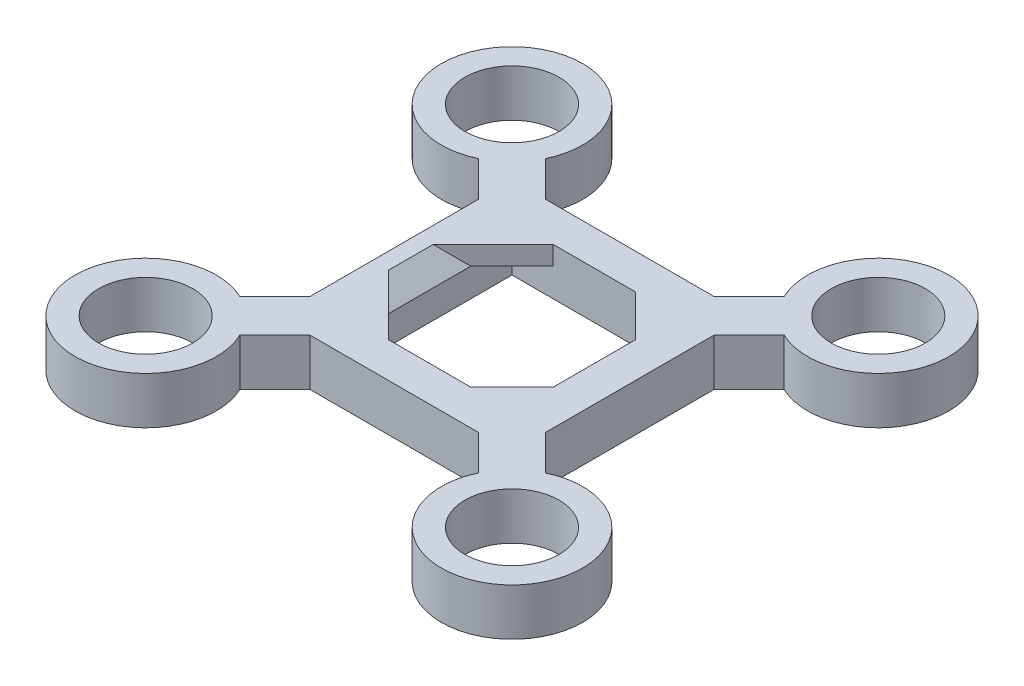
ISO-10303-21;
HEADER;
FILE_DESCRIPTION(('STEP AP214'),'2;1');
FILE_NAME('part.step','',(''),(''),'','','');
FILE_SCHEMA(('AUTOMOTIVE_DESIGN { 1 0 10303 214 1 1 1 1 }'));
ENDSEC;
DATA;
#1=APPLICATION_CONTEXT('core data for automotive mechanical design processes');
#2=APPLICATION_PROTOCOL_DEFINITION('international standard','automotive_design',2000,#1);
#3=PRODUCT_CONTEXT('',#1,'mechanical');
#4=PRODUCT('Part','Part','',(#3));
#5=PRODUCT_RELATED_PRODUCT_CATEGORY('part','',(#4));
#6=PRODUCT_DEFINITION_FORMATION('','',#4);
#7=PRODUCT_DEFINITION_CONTEXT('part definition',#1,'design');
#8=PRODUCT_DEFINITION('design','',#6,#7);
#9=PRODUCT_DEFINITION_SHAPE('','',#8);
#10=(LENGTH_UNIT() NAMED_UNIT(*) SI_UNIT(.MILLI.,.METRE.));
#11=(NAMED_UNIT(*) PLANE_ANGLE_UNIT() SI_UNIT($,.RADIAN.));
#12=(NAMED_UNIT(*) SI_UNIT($,.STERADIAN.) SOLID_ANGLE_UNIT());
#13=UNCERTAINTY_MEASURE_WITH_UNIT(LENGTH_MEASURE(1.E-05),#10,'distance_accuracy_value','');
#14=(GEOMETRIC_REPRESENTATION_CONTEXT(3) GLOBAL_UNCERTAINTY_ASSIGNED_CONTEXT((#13)) GLOBAL_UNIT_ASSIGNED_CONTEXT((#10,
#11,#12)) REPRESENTATION_CONTEXT('',''));
#15=CARTESIAN_POINT('',(0.,0.,0.));
#16=DIRECTION('',(0.,0.,1.));
#17=DIRECTION('',(1.,0.,0.));
#18=AXIS2_PLACEMENT_3D('',#15,#16,#17);
#19=CARTESIAN_POINT('',(1.75,1.,0.));
#20=DIRECTION('',(-1.,0.,0.));
#21=DIRECTION('',(0.,0.,1.));
#22=AXIS2_PLACEMENT_3D('',#19,#20,#21);
#23=PLANE('',#22);
#24=DIRECTION('',(0.,1.,0.));
#25=VECTOR('',#24,1.);
#26=CARTESIAN_POINT('',(1.75,0.6,0.875));
#27=LINE('',#26,#25);
#28=CARTESIAN_POINT('',(1.75,0.6,0.875));
#29=VERTEX_POINT('',#28);
#30=CARTESIAN_POINT('',(1.75,1.,0.875));
#31=VERTEX_POINT('',#30);
#32=EDGE_CURVE('E450',#29,#31,#27,.T.);
#33=ORIENTED_EDGE('',*,*,#32,.T.);
#34=DIRECTION('',(0.,0.,-1.));
#35=VECTOR('',#34,1.);
#36=CARTESIAN_POINT('',(1.75,1.,0.));
#37=LINE('',#36,#35);
#38=CARTESIAN_POINT('',(1.75,1.,-0.875000000000001));
#39=VERTEX_POINT('',#38);
#40=EDGE_CURVE('E385',#31,#39,#37,.T.);
#41=ORIENTED_EDGE('',*,*,#40,.T.);
#42=DIRECTION('',(0.,1.,0.));
#43=VECTOR('',#42,1.);
#44=CARTESIAN_POINT('',(1.75,0.6,-0.875000000000001));
#45=LINE('',#44,#43);
#46=CARTESIAN_POINT('',(1.75,0.6,-0.875000000000001));
#47=VERTEX_POINT('',#46);
#48=EDGE_CURVE('E352',#47,#39,#45,.T.);
#49=ORIENTED_EDGE('',*,*,#48,.F.);
#50=DIRECTION('',(0.,0.,-1.));
#51=VECTOR('',#50,1.);
#52=CARTESIAN_POINT('',(1.75,0.6,-0.875000000000001));
#53=LINE('',#52,#51);
#54=CARTESIAN_POINT('',(1.75,0.6,-1.75));
#55=VERTEX_POINT('',#54);
#56=EDGE_CURVE('E455',#47,#55,#53,.T.);
#57=ORIENTED_EDGE('',*,*,#56,.T.);
#58=DIRECTION('',(0.,-1.,0.));
#59=VECTOR('',#58,1.);
#60=CARTESIAN_POINT('',(1.75,1.,-1.75));
#61=LINE('',#60,#59);
#62=CARTESIAN_POINT('',(1.75,0.,-1.75));
#63=VERTEX_POINT('',#62);
#64=EDGE_CURVE('E272',#55,#63,#61,.T.);
#65=ORIENTED_EDGE('',*,*,#64,.T.);
#66=DIRECTION('',(0.,0.,-1.));
#67=VECTOR('',#66,1.);
#68=CARTESIAN_POINT('',(1.75,0.,0.));
#69=LINE('',#68,#67);
#70=CARTESIAN_POINT('',(1.75,0.,1.75));
#71=VERTEX_POINT('',#70);
#72=EDGE_CURVE('E260',#71,#63,#69,.T.);
#73=ORIENTED_EDGE('',*,*,#72,.F.);
#74=DIRECTION('',(0.,-1.,0.));
#75=VECTOR('',#74,1.);
#76=CARTESIAN_POINT('',(1.75,1.,1.75));
#77=LINE('',#76,#75);
#78=CARTESIAN_POINT('',(1.75,0.6,1.75));
#79=VERTEX_POINT('',#78);
#80=EDGE_CURVE('E279',#79,#71,#77,.T.);
#81=ORIENTED_EDGE('',*,*,#80,.F.);
#82=DIRECTION('',(0.,0.,-1.));
#83=VECTOR('',#82,1.);
#84=CARTESIAN_POINT('',(1.75,0.6,0.875));
#85=LINE('',#84,#83);
#86=EDGE_CURVE('E445',#79,#29,#85,.T.);
#87=ORIENTED_EDGE('',*,*,#86,.T.);
#88=EDGE_LOOP('',(#33,#41,#49,#57,#65,#73,#81,#87));
#89=FACE_BOUND('',#88,.T.);
#90=ADVANCED_FACE('F33',(#89),#23,.T.);
#91=CARTESIAN_POINT('',(0.,1.,1.75));
#92=DIRECTION('',(0.,0.,-1.));
#93=DIRECTION('',(-1.,0.,0.));
#94=AXIS2_PLACEMENT_3D('',#91,#92,#93);
#95=PLANE('',#94);
#96=DIRECTION('',(0.,1.,0.));
#97=VECTOR('',#96,1.);
#98=CARTESIAN_POINT('',(0.874999999999999,0.6,1.75));
#99=LINE('',#98,#97);
#100=CARTESIAN_POINT('',(0.874999999999999,0.6,1.75));
#101=VERTEX_POINT('',#100);
#102=CARTESIAN_POINT('',(0.874999999999999,1.,1.75));
#103=VERTEX_POINT('',#102);
#104=EDGE_CURVE('E447',#101,#103,#99,.T.);
#105=ORIENTED_EDGE('',*,*,#104,.F.);
#106=DIRECTION('',(1.,0.,0.));
#107=VECTOR('',#106,1.);
#108=CARTESIAN_POINT('',(1.75,0.6,1.75));
#109=LINE('',#108,#107);
#110=EDGE_CURVE('E443',#101,#79,#109,.T.);
#111=ORIENTED_EDGE('',*,*,#110,.T.);
#112=ORIENTED_EDGE('',*,*,#80,.T.);
#113=DIRECTION('',(1.,0.,0.));
#114=VECTOR('',#113,1.);
#115=CARTESIAN_POINT('',(0.,0.,1.75));
#116=LINE('',#115,#114);
#117=CARTESIAN_POINT('',(-1.75,0.,1.75));
#118=VERTEX_POINT('',#117);
#119=EDGE_CURVE('E263',#118,#71,#116,.T.);
#120=ORIENTED_EDGE('',*,*,#119,.F.);
#121=DIRECTION('',(0.,-1.,0.));
#122=VECTOR('',#121,1.);
#123=CARTESIAN_POINT('',(-1.75,1.,1.75));
#124=LINE('',#123,#122);
#125=CARTESIAN_POINT('',(-1.75,0.6,1.75));
#126=VERTEX_POINT('',#125);
#127=EDGE_CURVE('E277',#126,#118,#124,.T.);
#128=ORIENTED_EDGE('',*,*,#127,.F.);
#129=DIRECTION('',(1.,0.,0.));
#130=VECTOR('',#129,1.);
#131=CARTESIAN_POINT('',(-0.875,0.6,1.75));
#132=LINE('',#131,#130);
#133=CARTESIAN_POINT('',(-0.875,0.6,1.75));
#134=VERTEX_POINT('',#133);
#135=EDGE_CURVE('E345',#126,#134,#132,.T.);
#136=ORIENTED_EDGE('',*,*,#135,.T.);
#137=DIRECTION('',(0.,1.,0.));
#138=VECTOR('',#137,1.);
#139=CARTESIAN_POINT('',(-0.875,0.6,1.75));
#140=LINE('',#139,#138);
#141=CARTESIAN_POINT('',(-0.875,1.,1.75));
#142=VERTEX_POINT('',#141);
#143=EDGE_CURVE('E342',#134,#142,#140,.T.);
#144=ORIENTED_EDGE('',*,*,#143,.T.);
#145=DIRECTION('',(1.,0.,0.));
#146=VECTOR('',#145,1.);
#147=CARTESIAN_POINT('',(0.,1.,1.75));
#148=LINE('',#147,#146);
#149=EDGE_CURVE('E387',#142,#103,#148,.T.);
#150=ORIENTED_EDGE('',*,*,#149,.T.);
#151=EDGE_LOOP('',(#105,#111,#112,#120,#128,#136,#144,#150));
#152=FACE_BOUND('',#151,.T.);
#153=ADVANCED_FACE('F474',(#152),#95,.T.);
#154=CARTESIAN_POINT('',(-1.75,1.,0.));
#155=DIRECTION('',(-1.,0.,0.));
#156=DIRECTION('',(0.,0.,1.));
#157=AXIS2_PLACEMENT_3D('',#154,#155,#156);
#158=PLANE('',#157);
#159=DIRECTION('',(0.,0.,1.));
#160=VECTOR('',#159,1.);
#161=CARTESIAN_POINT('',(-1.75,0.6,-1.75));
#162=LINE('',#161,#160);
#163=CARTESIAN_POINT('',(-1.75,0.6,-1.75));
#164=VERTEX_POINT('',#163);
#165=CARTESIAN_POINT('',(-1.75,0.6,-0.875));
#166=VERTEX_POINT('',#165);
#167=EDGE_CURVE('E322',#164,#166,#162,.T.);
#168=ORIENTED_EDGE('',*,*,#167,.T.);
#169=DIRECTION('',(0.,0.,1.));
#170=VECTOR('',#169,1.);
#171=CARTESIAN_POINT('',(-1.75,0.599999999999999,0.875000000000001));
#172=LINE('',#171,#170);
#173=CARTESIAN_POINT('',(-1.75,0.6,0.875));
#174=VERTEX_POINT('',#173);
#175=EDGE_CURVE('E307',#166,#174,#172,.T.);
#176=ORIENTED_EDGE('',*,*,#175,.T.);
#177=DIRECTION('',(0.,0.,1.));
#178=VECTOR('',#177,1.);
#179=CARTESIAN_POINT('',(-1.75,0.6,1.75));
#180=LINE('',#179,#178);
#181=EDGE_CURVE('E348',#174,#126,#180,.T.);
#182=ORIENTED_EDGE('',*,*,#181,.T.);
#183=ORIENTED_EDGE('',*,*,#127,.T.);
#184=DIRECTION('',(0.,0.,-1.));
#185=VECTOR('',#184,1.);
#186=CARTESIAN_POINT('',(-1.75,0.,0.));
#187=LINE('',#186,#185);
#188=CARTESIAN_POINT('',(-1.75,0.,-1.75));
#189=VERTEX_POINT('',#188);
#190=EDGE_CURVE('E266',#118,#189,#187,.T.);
#191=ORIENTED_EDGE('',*,*,#190,.T.);
#192=DIRECTION('',(0.,-1.,0.));
#193=VECTOR('',#192,1.);
#194=CARTESIAN_POINT('',(-1.75,1.,-1.75));
#195=LINE('',#194,#193);
#196=EDGE_CURVE('E274',#164,#189,#195,.T.);
#197=ORIENTED_EDGE('',*,*,#196,.F.);
#198=EDGE_LOOP('',(#168,#176,#182,#183,#191,#197));
#199=FACE_BOUND('',#198,.T.);
#200=ADVANCED_FACE('F329',(#199),#158,.F.);
#201=CARTESIAN_POINT('',(0.353553390593218,1.,0.353553390593209));
#202=DIRECTION('',(-0.707106781186557,0.,-0.707106781186538));
#203=DIRECTION('',(-0.707106781186538,0.,0.707106781186557));
#204=AXIS2_PLACEMENT_3D('',#201,#202,#203);
#205=PLANE('',#204);
#206=DIRECTION('',(0.707106781186538,0.,-0.707106781186557));
#207=VECTOR('',#206,1.);
#208=CARTESIAN_POINT('',(0.353553390593218,1.,0.353553390593209));
#209=LINE('',#208,#207);
#210=CARTESIAN_POINT('',(-2.53553390593275,1.,3.24264068711925));
#211=VERTEX_POINT('',#210);
#212=CARTESIAN_POINT('',(-1.79289321881352,1.,2.5));
#213=VERTEX_POINT('',#212);
#214=EDGE_CURVE('E48',#211,#213,#209,.T.);
#215=ORIENTED_EDGE('',*,*,#214,.F.);
#216=DIRECTION('',(0.,1.,0.));
#217=VECTOR('',#216,1.);
#218=CARTESIAN_POINT('',(-2.53553390593275,0.,3.24264068711925));
#219=LINE('',#218,#217);
#220=CARTESIAN_POINT('',(-2.53553390593275,0.,3.24264068711925));
#221=VERTEX_POINT('',#220);
#222=EDGE_CURVE('E916',#211,#221,#219,.F.);
#223=ORIENTED_EDGE('',*,*,#222,.T.);
#224=DIRECTION('',(0.707106781186538,0.,-0.707106781186557));
#225=VECTOR('',#224,1.);
#226=CARTESIAN_POINT('',(0.353553390593218,0.,0.353553390593209));
#227=LINE('',#226,#225);
#228=CARTESIAN_POINT('',(-1.79289321881352,0.,2.5));
#229=VERTEX_POINT('',#228);
#230=EDGE_CURVE('E358',#221,#229,#227,.T.);
#231=ORIENTED_EDGE('',*,*,#230,.T.);
#232=DIRECTION('',(0.,-1.,0.));
#233=VECTOR('',#232,1.);
#234=CARTESIAN_POINT('',(-1.79289321881352,1.,2.5));
#235=LINE('',#234,#233);
#236=EDGE_CURVE('E275',#213,#229,#235,.T.);
#237=ORIENTED_EDGE('',*,*,#236,.F.);
#238=EDGE_LOOP('',(#215,#223,#231,#237));
#239=FACE_BOUND('',#238,.T.);
#240=ADVANCED_FACE('F531',(#239),#205,.F.);
#241=CARTESIAN_POINT('',(0.,1.,2.5));
#242=DIRECTION('',(0.,0.,-1.));
#243=DIRECTION('',(-1.,0.,0.));
#244=AXIS2_PLACEMENT_3D('',#241,#242,#243);
#245=PLANE('',#244);
#246=DIRECTION('',(1.,0.,0.));
#247=VECTOR('',#246,1.);
#248=CARTESIAN_POINT('',(0.,0.,2.5));
#249=LINE('',#248,#247);
#250=CARTESIAN_POINT('',(1.79289321881352,0.,2.5));
#251=VERTEX_POINT('',#250);
#252=EDGE_CURVE('E392',#229,#251,#249,.T.);
#253=ORIENTED_EDGE('',*,*,#252,.T.);
#254=DIRECTION('',(0.,-1.,0.));
#255=VECTOR('',#254,1.);
#256=CARTESIAN_POINT('',(1.79289321881352,1.,2.5));
#257=LINE('',#256,#255);
#258=CARTESIAN_POINT('',(1.79289321881352,1.,2.5));
#259=VERTEX_POINT('',#258);
#260=EDGE_CURVE('E300',#259,#251,#257,.T.);
#261=ORIENTED_EDGE('',*,*,#260,.F.);
#262=DIRECTION('',(1.,0.,0.));
#263=VECTOR('',#262,1.);
#264=CARTESIAN_POINT('',(0.,1.,2.5));
#265=LINE('',#264,#263);
#266=EDGE_CURVE('E360',#213,#259,#265,.T.);
#267=ORIENTED_EDGE('',*,*,#266,.F.);
#268=ORIENTED_EDGE('',*,*,#236,.T.);
#269=EDGE_LOOP('',(#253,#261,#267,#268));
#270=FACE_BOUND('',#269,.T.);
#271=ADVANCED_FACE('F528',(#270),#245,.F.);
#272=CARTESIAN_POINT('',(-0.353553390593219,1.,0.35355339059321));
#273=DIRECTION('',(-0.707106781186557,0.,0.707106781186538));
#274=DIRECTION('',(0.707106781186538,0.,0.707106781186557));
#275=AXIS2_PLACEMENT_3D('',#272,#273,#274);
#276=PLANE('',#275);
#277=DIRECTION('',(0.,1.,0.));
#278=VECTOR('',#277,1.);
#279=CARTESIAN_POINT('',(2.53553390593275,0.,3.24264068711926));
#280=LINE('',#279,#278);
#281=CARTESIAN_POINT('',(2.53553390593275,1.,3.24264068711926));
#282=VERTEX_POINT('',#281);
#283=CARTESIAN_POINT('',(2.53553390593275,0.,3.24264068711926));
#284=VERTEX_POINT('',#283);
#285=EDGE_CURVE('E421',#282,#284,#280,.F.);
#286=ORIENTED_EDGE('',*,*,#285,.F.);
#287=DIRECTION('',(-0.707106781186538,0.,-0.707106781186557));
#288=VECTOR('',#287,1.);
#289=CARTESIAN_POINT('',(-0.353553390593219,1.,0.35355339059321));
#290=LINE('',#289,#288);
#291=EDGE_CURVE('E363',#282,#259,#290,.T.);
#292=ORIENTED_EDGE('',*,*,#291,.T.);
#293=ORIENTED_EDGE('',*,*,#260,.T.);
#294=DIRECTION('',(-0.707106781186538,0.,-0.707106781186557));
#295=VECTOR('',#294,1.);
#296=CARTESIAN_POINT('',(-0.353553390593219,0.,0.35355339059321));
#297=LINE('',#296,#295);
#298=EDGE_CURVE('E395',#284,#251,#297,.T.);
#299=ORIENTED_EDGE('',*,*,#298,.F.);
#300=EDGE_LOOP('',(#286,#292,#293,#299));
#301=FACE_BOUND('',#300,.T.);
#302=ADVANCED_FACE('F525',(#301),#276,.T.);
#303=CARTESIAN_POINT('',(0.353553390593209,1.,-0.353553390593218));
#304=DIRECTION('',(-0.707106781186539,0.,0.707106781186556));
#305=DIRECTION('',(0.707106781186556,0.,0.707106781186539));
#306=AXIS2_PLACEMENT_3D('',#303,#304,#305);
#307=PLANE('',#306);
#308=DIRECTION('',(-0.707106781186556,0.,-0.707106781186539));
#309=VECTOR('',#308,1.);
#310=CARTESIAN_POINT('',(0.353553390593209,1.,-0.353553390593218));
#311=LINE('',#310,#309);
#312=CARTESIAN_POINT('',(3.24264068711925,1.,2.53553390593275));
#313=VERTEX_POINT('',#312);
#314=CARTESIAN_POINT('',(2.5,1.,1.79289321881352));
#315=VERTEX_POINT('',#314);
#316=EDGE_CURVE('E365',#313,#315,#311,.T.);
#317=ORIENTED_EDGE('',*,*,#316,.F.);
#318=DIRECTION('',(0.,1.,0.));
#319=VECTOR('',#318,1.);
#320=CARTESIAN_POINT('',(3.24264068711925,0.,2.53553390593275));
#321=LINE('',#320,#319);
#322=CARTESIAN_POINT('',(3.24264068711925,0.,2.53553390593275));
#323=VERTEX_POINT('',#322);
#324=EDGE_CURVE('E419',#313,#323,#321,.F.);
#325=ORIENTED_EDGE('',*,*,#324,.T.);
#326=DIRECTION('',(-0.707106781186556,0.,-0.707106781186539));
#327=VECTOR('',#326,1.);
#328=CARTESIAN_POINT('',(0.353553390593209,0.,-0.353553390593218));
#329=LINE('',#328,#327);
#330=CARTESIAN_POINT('',(2.5,0.,1.79289321881352));
#331=VERTEX_POINT('',#330);
#332=EDGE_CURVE('E397',#323,#331,#329,.T.);
#333=ORIENTED_EDGE('',*,*,#332,.T.);
#334=DIRECTION('',(0.,-1.,0.));
#335=VECTOR('',#334,1.);
#336=CARTESIAN_POINT('',(2.5,1.,1.79289321881352));
#337=LINE('',#336,#335);
#338=EDGE_CURVE('E297',#315,#331,#337,.T.);
#339=ORIENTED_EDGE('',*,*,#338,.F.);
#340=EDGE_LOOP('',(#317,#325,#333,#339));
#341=FACE_BOUND('',#340,.T.);
#342=ADVANCED_FACE('F418',(#341),#307,.F.);
#343=CARTESIAN_POINT('',(2.5,1.,0.));
#344=DIRECTION('',(-1.,0.,0.));
#345=DIRECTION('',(0.,0.,1.));
#346=AXIS2_PLACEMENT_3D('',#343,#344,#345);
#347=PLANE('',#346);
#348=DIRECTION('',(0.,0.,-1.));
#349=VECTOR('',#348,1.);
#350=CARTESIAN_POINT('',(2.5,0.,0.));
#351=LINE('',#350,#349);
#352=CARTESIAN_POINT('',(2.5,0.,-1.79289321881352));
#353=VERTEX_POINT('',#352);
#354=EDGE_CURVE('E248',#331,#353,#351,.T.);
#355=ORIENTED_EDGE('',*,*,#354,.T.);
#356=DIRECTION('',(0.,-1.,0.));
#357=VECTOR('',#356,1.);
#358=CARTESIAN_POINT('',(2.5,1.,-1.79289321881352));
#359=LINE('',#358,#357);
#360=CARTESIAN_POINT('',(2.5,1.,-1.79289321881352));
#361=VERTEX_POINT('',#360);
#362=EDGE_CURVE('E294',#361,#353,#359,.T.);
#363=ORIENTED_EDGE('',*,*,#362,.F.);
#364=DIRECTION('',(0.,0.,-1.));
#365=VECTOR('',#364,1.);
#366=CARTESIAN_POINT('',(2.5,1.,0.));
#367=LINE('',#366,#365);
#368=EDGE_CURVE('E367',#315,#361,#367,.T.);
#369=ORIENTED_EDGE('',*,*,#368,.F.);
#370=ORIENTED_EDGE('',*,*,#338,.T.);
#371=EDGE_LOOP('',(#355,#363,#369,#370));
#372=FACE_BOUND('',#371,.T.);
#373=ADVANCED_FACE('F402',(#372),#347,.F.);
#374=CARTESIAN_POINT('',(0.353553390593209,1.,0.353553390593218));
#375=DIRECTION('',(0.707106781186539,0.,0.707106781186556));
#376=DIRECTION('',(0.707106781186556,0.,-0.707106781186539));
#377=AXIS2_PLACEMENT_3D('',#374,#375,#376);
#378=PLANE('',#377);
#379=DIRECTION('',(0.,1.,0.));
#380=VECTOR('',#379,1.);
#381=CARTESIAN_POINT('',(3.24264068711925,0.,-2.53553390593275));
#382=LINE('',#381,#380);
#383=CARTESIAN_POINT('',(3.24264068711925,1.,-2.53553390593275));
#384=VERTEX_POINT('',#383);
#385=CARTESIAN_POINT('',(3.24264068711925,0.,-2.53553390593275));
#386=VERTEX_POINT('',#385);
#387=EDGE_CURVE('E225',#384,#386,#382,.F.);
#388=ORIENTED_EDGE('',*,*,#387,.F.);
#389=DIRECTION('',(-0.707106781186556,0.,0.707106781186539));
#390=VECTOR('',#389,1.);
#391=CARTESIAN_POINT('',(0.353553390593209,1.,0.353553390593218));
#392=LINE('',#391,#390);
#393=EDGE_CURVE('E370',#384,#361,#392,.T.);
#394=ORIENTED_EDGE('',*,*,#393,.T.);
#395=ORIENTED_EDGE('',*,*,#362,.T.);
#396=DIRECTION('',(-0.707106781186556,0.,0.707106781186539));
#397=VECTOR('',#396,1.);
#398=CARTESIAN_POINT('',(0.353553390593209,0.,0.353553390593218));
#399=LINE('',#398,#397);
#400=EDGE_CURVE('E244',#386,#353,#399,.T.);
#401=ORIENTED_EDGE('',*,*,#400,.F.);
#402=EDGE_LOOP('',(#388,#394,#395,#401));
#403=FACE_BOUND('',#402,.T.);
#404=ADVANCED_FACE('F407',(#403),#378,.T.);
#405=CARTESIAN_POINT('',(-0.353553390593219,1.,-0.35355339059321));
#406=DIRECTION('',(0.707106781186557,0.,0.707106781186538));
#407=DIRECTION('',(0.707106781186538,0.,-0.707106781186557));
#408=AXIS2_PLACEMENT_3D('',#405,#406,#407);
#409=PLANE('',#408);
#410=DIRECTION('',(-0.707106781186538,0.,0.707106781186557));
#411=VECTOR('',#410,1.);
#412=CARTESIAN_POINT('',(-0.353553390593219,1.,-0.35355339059321));
#413=LINE('',#412,#411);
#414=CARTESIAN_POINT('',(2.53553390593275,1.,-3.24264068711926));
#415=VERTEX_POINT('',#414);
#416=CARTESIAN_POINT('',(1.79289321881352,1.,-2.5));
#417=VERTEX_POINT('',#416);
#418=EDGE_CURVE('E236',#415,#417,#413,.T.);
#419=ORIENTED_EDGE('',*,*,#418,.F.);
#420=DIRECTION('',(0.,1.,0.));
#421=VECTOR('',#420,1.);
#422=CARTESIAN_POINT('',(2.53553390593275,0.,-3.24264068711926));
#423=LINE('',#422,#421);
#424=CARTESIAN_POINT('',(2.53553390593275,0.,-3.24264068711926));
#425=VERTEX_POINT('',#424);
#426=EDGE_CURVE('E222',#415,#425,#423,.F.);
#427=ORIENTED_EDGE('',*,*,#426,.T.);
#428=DIRECTION('',(-0.707106781186538,0.,0.707106781186557));
#429=VECTOR('',#428,1.);
#430=CARTESIAN_POINT('',(-0.353553390593219,0.,-0.35355339059321));
#431=LINE('',#430,#429);
#432=CARTESIAN_POINT('',(1.79289321881352,0.,-2.5));
#433=VERTEX_POINT('',#432);
#434=EDGE_CURVE('E234',#425,#433,#431,.T.);
#435=ORIENTED_EDGE('',*,*,#434,.T.);
#436=DIRECTION('',(0.,-1.,0.));
#437=VECTOR('',#436,1.);
#438=CARTESIAN_POINT('',(1.79289321881352,1.,-2.5));
#439=LINE('',#438,#437);
#440=EDGE_CURVE('E292',#417,#433,#439,.T.);
#441=ORIENTED_EDGE('',*,*,#440,.F.);
#442=EDGE_LOOP('',(#419,#427,#435,#441));
#443=FACE_BOUND('',#442,.T.);
#444=ADVANCED_FACE('F232',(#443),#409,.F.);
#445=CARTESIAN_POINT('',(0.,1.,-2.5));
#446=DIRECTION('',(0.,0.,-1.));
#447=DIRECTION('',(-1.,0.,0.));
#448=AXIS2_PLACEMENT_3D('',#445,#446,#447);
#449=PLANE('',#448);
#450=DIRECTION('',(1.,0.,0.));
#451=VECTOR('',#450,1.);
#452=CARTESIAN_POINT('',(0.,0.,-2.5));
#453=LINE('',#452,#451);
#454=CARTESIAN_POINT('',(-1.79289321881352,0.,-2.5));
#455=VERTEX_POINT('',#454);
#456=EDGE_CURVE('E243',#455,#433,#453,.T.);
#457=ORIENTED_EDGE('',*,*,#456,.F.);
#458=DIRECTION('',(0.,-1.,0.));
#459=VECTOR('',#458,1.);
#460=CARTESIAN_POINT('',(-1.79289321881352,1.,-2.5));
#461=LINE('',#460,#459);
#462=CARTESIAN_POINT('',(-1.79289321881352,1.,-2.5));
#463=VERTEX_POINT('',#462);
#464=EDGE_CURVE('E289',#463,#455,#461,.T.);
#465=ORIENTED_EDGE('',*,*,#464,.F.);
#466=DIRECTION('',(1.,0.,0.));
#467=VECTOR('',#466,1.);
#468=CARTESIAN_POINT('',(0.,1.,-2.5));
#469=LINE('',#468,#467);
#470=EDGE_CURVE('E373',#463,#417,#469,.T.);
#471=ORIENTED_EDGE('',*,*,#470,.T.);
#472=ORIENTED_EDGE('',*,*,#440,.T.);
#473=EDGE_LOOP('',(#457,#465,#471,#472));
#474=FACE_BOUND('',#473,.T.);
#475=ADVANCED_FACE('F512',(#474),#449,.T.);
#476=CARTESIAN_POINT('',(0.353553390593218,1.,-0.353553390593209));
#477=DIRECTION('',(0.707106781186557,0.,-0.707106781186538));
#478=DIRECTION('',(-0.707106781186538,0.,-0.707106781186557));
#479=AXIS2_PLACEMENT_3D('',#476,#477,#478);
#480=PLANE('',#479);
#481=DIRECTION('',(0.,1.,0.));
#482=VECTOR('',#481,1.);
#483=CARTESIAN_POINT('',(-2.53553390593275,0.,-3.24264068711925));
#484=LINE('',#483,#482);
#485=CARTESIAN_POINT('',(-2.53553390593275,1.,-3.24264068711925));
#486=VERTEX_POINT('',#485);
#487=CARTESIAN_POINT('',(-2.53553390593275,0.,-3.24264068711925));
#488=VERTEX_POINT('',#487);
#489=EDGE_CURVE('E436',#486,#488,#484,.F.);
#490=ORIENTED_EDGE('',*,*,#489,.F.);
#491=DIRECTION('',(0.707106781186538,0.,0.707106781186557));
#492=VECTOR('',#491,1.);
#493=CARTESIAN_POINT('',(0.353553390593218,1.,-0.353553390593209));
#494=LINE('',#493,#492);
#495=EDGE_CURVE('E376',#486,#463,#494,.T.);
#496=ORIENTED_EDGE('',*,*,#495,.T.);
#497=ORIENTED_EDGE('',*,*,#464,.T.);
#498=DIRECTION('',(0.707106781186538,0.,0.707106781186557));
#499=VECTOR('',#498,1.);
#500=CARTESIAN_POINT('',(0.353553390593218,0.,-0.353553390593209));
#501=LINE('',#500,#499);
#502=EDGE_CURVE('E246',#488,#455,#501,.T.);
#503=ORIENTED_EDGE('',*,*,#502,.F.);
#504=EDGE_LOOP('',(#490,#496,#497,#503));
#505=FACE_BOUND('',#504,.T.);
#506=ADVANCED_FACE('F508',(#505),#480,.T.);
#507=CARTESIAN_POINT('',(-0.353553390593211,1.,0.35355339059322));
#508=DIRECTION('',(0.707106781186539,0.,-0.707106781186557));
#509=DIRECTION('',(-0.707106781186557,0.,-0.707106781186539));
#510=AXIS2_PLACEMENT_3D('',#507,#508,#509);
#511=PLANE('',#510);
#512=DIRECTION('',(0.707106781186557,0.,0.707106781186539));
#513=VECTOR('',#512,1.);
#514=CARTESIAN_POINT('',(-0.353553390593211,1.,0.35355339059322));
#515=LINE('',#514,#513);
#516=CARTESIAN_POINT('',(-3.24264068711926,1.,-2.53553390593275));
#517=VERTEX_POINT('',#516);
#518=CARTESIAN_POINT('',(-2.5,1.,-1.79289321881352));
#519=VERTEX_POINT('',#518);
#520=EDGE_CURVE('E378',#517,#519,#515,.T.);
#521=ORIENTED_EDGE('',*,*,#520,.F.);
#522=DIRECTION('',(0.,1.,0.));
#523=VECTOR('',#522,1.);
#524=CARTESIAN_POINT('',(-3.24264068711926,0.,-2.53553390593275));
#525=LINE('',#524,#523);
#526=CARTESIAN_POINT('',(-3.24264068711926,0.,-2.53553390593275));
#527=VERTEX_POINT('',#526);
#528=EDGE_CURVE('E432',#517,#527,#525,.F.);
#529=ORIENTED_EDGE('',*,*,#528,.T.);
#530=DIRECTION('',(0.707106781186557,0.,0.707106781186539));
#531=VECTOR('',#530,1.);
#532=CARTESIAN_POINT('',(-0.353553390593211,0.,0.35355339059322));
#533=LINE('',#532,#531);
#534=CARTESIAN_POINT('',(-2.5,0.,-1.79289321881352));
#535=VERTEX_POINT('',#534);
#536=EDGE_CURVE('E253',#527,#535,#533,.T.);
#537=ORIENTED_EDGE('',*,*,#536,.T.);
#538=DIRECTION('',(0.,-1.,0.));
#539=VECTOR('',#538,1.);
#540=CARTESIAN_POINT('',(-2.5,1.,-1.79289321881352));
#541=LINE('',#540,#539);
#542=EDGE_CURVE('E285',#519,#535,#541,.T.);
#543=ORIENTED_EDGE('',*,*,#542,.F.);
#544=EDGE_LOOP('',(#521,#529,#537,#543));
#545=FACE_BOUND('',#544,.T.);
#546=ADVANCED_FACE('F504',(#545),#511,.F.);
#547=CARTESIAN_POINT('',(-2.5,1.,0.));
#548=DIRECTION('',(-1.,0.,0.));
#549=DIRECTION('',(0.,0.,1.));
#550=AXIS2_PLACEMENT_3D('',#547,#548,#549);
#551=PLANE('',#550);
#552=DIRECTION('',(0.,0.,-1.));
#553=VECTOR('',#552,1.);
#554=CARTESIAN_POINT('',(-2.5,0.,0.));
#555=LINE('',#554,#553);
#556=CARTESIAN_POINT('',(-2.5,0.,1.79289321881352));
#557=VERTEX_POINT('',#556);
#558=EDGE_CURVE('E255',#557,#535,#555,.T.);
#559=ORIENTED_EDGE('',*,*,#558,.F.);
#560=DIRECTION('',(0.,-1.,0.));
#561=VECTOR('',#560,1.);
#562=CARTESIAN_POINT('',(-2.5,1.,1.79289321881352));
#563=LINE('',#562,#561);
#564=CARTESIAN_POINT('',(-2.5,1.,1.79289321881352));
#565=VERTEX_POINT('',#564);
#566=EDGE_CURVE('E282',#565,#557,#563,.T.);
#567=ORIENTED_EDGE('',*,*,#566,.F.);
#568=DIRECTION('',(0.,0.,-1.));
#569=VECTOR('',#568,1.);
#570=CARTESIAN_POINT('',(-2.5,1.,0.));
#571=LINE('',#570,#569);
#572=EDGE_CURVE('E380',#565,#519,#571,.T.);
#573=ORIENTED_EDGE('',*,*,#572,.T.);
#574=ORIENTED_EDGE('',*,*,#542,.T.);
#575=EDGE_LOOP('',(#559,#567,#573,#574));
#576=FACE_BOUND('',#575,.T.);
#577=ADVANCED_FACE('F500',(#576),#551,.T.);
#578=CARTESIAN_POINT('',(-0.353553390593211,1.,-0.35355339059322));
#579=DIRECTION('',(-0.707106781186539,0.,-0.707106781186557));
#580=DIRECTION('',(-0.707106781186557,0.,0.707106781186539));
#581=AXIS2_PLACEMENT_3D('',#578,#579,#580);
#582=PLANE('',#581);
#583=DIRECTION('',(0.,1.,0.));
#584=VECTOR('',#583,1.);
#585=CARTESIAN_POINT('',(-3.24264068711926,0.,2.53553390593275));
#586=LINE('',#585,#584);
#587=CARTESIAN_POINT('',(-3.24264068711926,1.,2.53553390593275));
#588=VERTEX_POINT('',#587);
#589=CARTESIAN_POINT('',(-3.24264068711926,0.,2.53553390593275));
#590=VERTEX_POINT('',#589);
#591=EDGE_CURVE('E913',#588,#590,#586,.F.);
#592=ORIENTED_EDGE('',*,*,#591,.F.);
#593=DIRECTION('',(0.707106781186556,0.,-0.707106781186539));
#594=VECTOR('',#593,1.);
#595=CARTESIAN_POINT('',(-0.353553390593211,1.,-0.35355339059322));
#596=LINE('',#595,#594);
#597=EDGE_CURVE('E383',#588,#565,#596,.T.);
#598=ORIENTED_EDGE('',*,*,#597,.T.);
#599=ORIENTED_EDGE('',*,*,#566,.T.);
#600=DIRECTION('',(0.707106781186556,0.,-0.707106781186539));
#601=VECTOR('',#600,1.);
#602=CARTESIAN_POINT('',(-0.353553390593211,0.,-0.35355339059322));
#603=LINE('',#602,#601);
#604=EDGE_CURVE('E258',#590,#557,#603,.T.);
#605=ORIENTED_EDGE('',*,*,#604,.F.);
#606=EDGE_LOOP('',(#592,#598,#599,#605));
#607=FACE_BOUND('',#606,.T.);
#608=ADVANCED_FACE('F496',(#607),#582,.T.);
#609=CARTESIAN_POINT('',(0.,1.,-1.75));
#610=DIRECTION('',(0.,0.,-1.));
#611=DIRECTION('',(-1.,0.,0.));
#612=AXIS2_PLACEMENT_3D('',#609,#610,#611);
#613=PLANE('',#612);
#614=DIRECTION('',(-1.,0.,0.));
#615=VECTOR('',#614,1.);
#616=CARTESIAN_POINT('',(1.75,0.6,-1.75));
#617=LINE('',#616,#615);
#618=CARTESIAN_POINT('',(0.874999999999999,0.6,-1.75));
#619=VERTEX_POINT('',#618);
#620=EDGE_CURVE('E458',#55,#619,#617,.T.);
#621=ORIENTED_EDGE('',*,*,#620,.T.);
#622=DIRECTION('',(0.,1.,0.));
#623=VECTOR('',#622,1.);
#624=CARTESIAN_POINT('',(0.874999999999999,0.6,-1.75));
#625=LINE('',#624,#623);
#626=CARTESIAN_POINT('',(0.874999999999999,1.,-1.75));
#627=VERTEX_POINT('',#626);
#628=EDGE_CURVE('E464',#619,#627,#625,.T.);
#629=ORIENTED_EDGE('',*,*,#628,.T.);
#630=DIRECTION('',(1.,0.,0.));
#631=VECTOR('',#630,1.);
#632=CARTESIAN_POINT('',(0.,1.,-1.75));
#633=LINE('',#632,#631);
#634=CARTESIAN_POINT('',(-0.875,1.,-1.75));
#635=VERTEX_POINT('',#634);
#636=EDGE_CURVE('E286',#635,#627,#633,.T.);
#637=ORIENTED_EDGE('',*,*,#636,.F.);
#638=DIRECTION('',(0.,1.,0.));
#639=VECTOR('',#638,1.);
#640=CARTESIAN_POINT('',(-0.875,0.6,-1.75));
#641=LINE('',#640,#639);
#642=CARTESIAN_POINT('',(-0.875,0.6,-1.75));
#643=VERTEX_POINT('',#642);
#644=EDGE_CURVE('E355',#643,#635,#641,.T.);
#645=ORIENTED_EDGE('',*,*,#644,.F.);
#646=DIRECTION('',(-1.,0.,0.));
#647=VECTOR('',#646,1.);
#648=CARTESIAN_POINT('',(-0.875,0.6,-1.75));
#649=LINE('',#648,#647);
#650=EDGE_CURVE('E324',#643,#164,#649,.T.);
#651=ORIENTED_EDGE('',*,*,#650,.T.);
#652=ORIENTED_EDGE('',*,*,#196,.T.);
#653=DIRECTION('',(1.,0.,0.));
#654=VECTOR('',#653,1.);
#655=CARTESIAN_POINT('',(0.,0.,-1.75));
#656=LINE('',#655,#654);
#657=EDGE_CURVE('E269',#189,#63,#656,.T.);
#658=ORIENTED_EDGE('',*,*,#657,.T.);
#659=ORIENTED_EDGE('',*,*,#64,.F.);
#660=EDGE_LOOP('',(#621,#629,#637,#645,#651,#652,#658,#659));
#661=FACE_BOUND('',#660,.T.);
#662=ADVANCED_FACE('F499',(#661),#613,.F.);
#663=CARTESIAN_POINT('',(0.,1.,0.));
#664=DIRECTION('',(0.,1.,0.));
#665=DIRECTION('',(0.,0.,1.));
#666=AXIS2_PLACEMENT_3D('',#663,#664,#665);
#667=PLANE('',#666);
#668=CARTESIAN_POINT('',(-3.88908729652601,1.,3.88908729652601));
#669=DIRECTION('',(0.,1.,0.));
#670=DIRECTION('',(0.,0.,-1.));
#671=AXIS2_PLACEMENT_3D('',#668,#669,#670);
#672=CIRCLE('',#671,1.);
#673=CARTESIAN_POINT('',(-3.88908729652601,1.,2.88908729652601));
#674=VERTEX_POINT('',#673);
#675=EDGE_CURVE('E897',#674,#674,#672,.T.);
#676=ORIENTED_EDGE('',*,*,#675,.F.);
#677=EDGE_LOOP('',(#676));
#678=FACE_BOUND('',#677,.T.);
#679=CARTESIAN_POINT('',(3.88908729652601,1.,-3.88908729652601));
#680=DIRECTION('',(0.,1.,0.));
#681=DIRECTION('',(0.,0.,1.));
#682=AXIS2_PLACEMENT_3D('',#679,#680,#681);
#683=CIRCLE('',#682,0.999999999999993);
#684=CARTESIAN_POINT('',(3.88908729652601,1.,-2.88908729652602));
#685=VERTEX_POINT('',#684);
#686=EDGE_CURVE('E899',#685,#685,#683,.T.);
#687=ORIENTED_EDGE('',*,*,#686,.F.);
#688=EDGE_LOOP('',(#687));
#689=FACE_BOUND('',#688,.T.);
#690=CARTESIAN_POINT('',(3.88908729652601,1.,3.88908729652601));
#691=DIRECTION('',(0.,1.,0.));
#692=DIRECTION('',(0.,0.,-1.));
#693=AXIS2_PLACEMENT_3D('',#690,#691,#692);
#694=CIRCLE('',#693,1.);
#695=CARTESIAN_POINT('',(3.88908729652601,1.,2.88908729652601));
#696=VERTEX_POINT('',#695);
#697=EDGE_CURVE('E941',#696,#696,#694,.T.);
#698=ORIENTED_EDGE('',*,*,#697,.F.);
#699=EDGE_LOOP('',(#698));
#700=FACE_BOUND('',#699,.T.);
#701=CARTESIAN_POINT('',(-3.88908729652601,1.,-3.88908729652601));
#702=DIRECTION('',(0.,1.,0.));
#703=DIRECTION('',(0.,0.,1.));
#704=AXIS2_PLACEMENT_3D('',#701,#702,#703);
#705=CIRCLE('',#704,1.);
#706=CARTESIAN_POINT('',(-3.88908729652601,1.,-2.88908729652601));
#707=VERTEX_POINT('',#706);
#708=EDGE_CURVE('E906',#707,#707,#705,.T.);
#709=ORIENTED_EDGE('',*,*,#708,.F.);
#710=EDGE_LOOP('',(#709));
#711=FACE_BOUND('',#710,.T.);
#712=CARTESIAN_POINT('',(-3.88908729652601,1.,3.88908729652601));
#713=DIRECTION('',(0.,1.,0.));
#714=DIRECTION('',(0.,0.,-1.));
#715=AXIS2_PLACEMENT_3D('',#712,#713,#714);
#716=CIRCLE('',#715,1.5);
#717=EDGE_CURVE('E55',#588,#211,#716,.T.);
#718=ORIENTED_EDGE('',*,*,#717,.T.);
#719=ORIENTED_EDGE('',*,*,#214,.T.);
#720=ORIENTED_EDGE('',*,*,#266,.T.);
#721=ORIENTED_EDGE('',*,*,#291,.F.);
#722=CARTESIAN_POINT('',(3.88908729652601,1.,3.88908729652601));
#723=DIRECTION('',(0.,1.,0.));
#724=DIRECTION('',(0.,0.,-1.));
#725=AXIS2_PLACEMENT_3D('',#722,#723,#724);
#726=CIRCLE('',#725,1.5);
#727=EDGE_CURVE('E414',#282,#313,#726,.T.);
#728=ORIENTED_EDGE('',*,*,#727,.T.);
#729=ORIENTED_EDGE('',*,*,#316,.T.);
#730=ORIENTED_EDGE('',*,*,#368,.T.);
#731=ORIENTED_EDGE('',*,*,#393,.F.);
#732=CARTESIAN_POINT('',(3.88908729652601,1.,-3.88908729652601));
#733=DIRECTION('',(0.,1.,0.));
#734=DIRECTION('',(0.,0.,1.));
#735=AXIS2_PLACEMENT_3D('',#732,#733,#734);
#736=CIRCLE('',#735,1.5);
#737=EDGE_CURVE('E229',#384,#415,#736,.T.);
#738=ORIENTED_EDGE('',*,*,#737,.T.);
#739=ORIENTED_EDGE('',*,*,#418,.T.);
#740=ORIENTED_EDGE('',*,*,#470,.F.);
#741=ORIENTED_EDGE('',*,*,#495,.F.);
#742=CARTESIAN_POINT('',(-3.88908729652601,1.,-3.88908729652601));
#743=DIRECTION('',(0.,1.,0.));
#744=DIRECTION('',(0.,0.,1.));
#745=AXIS2_PLACEMENT_3D('',#742,#743,#744);
#746=CIRCLE('',#745,1.5);
#747=EDGE_CURVE('E425',#486,#517,#746,.T.);
#748=ORIENTED_EDGE('',*,*,#747,.T.);
#749=ORIENTED_EDGE('',*,*,#520,.T.);
#750=ORIENTED_EDGE('',*,*,#572,.F.);
#751=ORIENTED_EDGE('',*,*,#597,.F.);
#752=EDGE_LOOP('',(#718,#719,#720,#721,#728,#729,#730,#731,#738,#739,#740,#741,#748,#749,#750,#751));
#753=FACE_BOUND('',#752,.T.);
#754=DIRECTION('',(0.,0.,-1.));
#755=VECTOR('',#754,1.);
#756=CARTESIAN_POINT('',(-2.15,1.,-0.875));
#757=LINE('',#756,#755);
#758=CARTESIAN_POINT('',(-2.15,1.,0.475000000000003));
#759=VERTEX_POINT('',#758);
#760=CARTESIAN_POINT('',(-2.15,1.,-0.475000000000003));
#761=VERTEX_POINT('',#760);
#762=EDGE_CURVE('E281',#759,#761,#757,.T.);
#763=ORIENTED_EDGE('',*,*,#762,.T.);
#764=DIRECTION('',(0.707106781186547,0.,-0.707106781186547));
#765=VECTOR('',#764,1.);
#766=CARTESIAN_POINT('',(-1.75,1.,-0.875));
#767=LINE('',#766,#765);
#768=EDGE_CURVE('E315',#761,#635,#767,.T.);
#769=ORIENTED_EDGE('',*,*,#768,.T.);
#770=ORIENTED_EDGE('',*,*,#636,.T.);
#771=DIRECTION('',(0.707106781186548,0.,0.707106781186547));
#772=VECTOR('',#771,1.);
#773=CARTESIAN_POINT('',(0.874999999999999,1.,-1.75));
#774=LINE('',#773,#772);
#775=EDGE_CURVE('E452',#627,#39,#774,.T.);
#776=ORIENTED_EDGE('',*,*,#775,.T.);
#777=ORIENTED_EDGE('',*,*,#40,.F.);
#778=DIRECTION('',(-0.707106781186548,0.,0.707106781186547));
#779=VECTOR('',#778,1.);
#780=CARTESIAN_POINT('',(0.874999999999999,1.,1.75));
#781=LINE('',#780,#779);
#782=EDGE_CURVE('E439',#31,#103,#781,.T.);
#783=ORIENTED_EDGE('',*,*,#782,.T.);
#784=ORIENTED_EDGE('',*,*,#149,.F.);
#785=DIRECTION('',(-0.707106781186547,0.,-0.707106781186547));
#786=VECTOR('',#785,1.);
#787=CARTESIAN_POINT('',(-1.75,1.,0.875));
#788=LINE('',#787,#786);
#789=EDGE_CURVE('E338',#142,#759,#788,.T.);
#790=ORIENTED_EDGE('',*,*,#789,.T.);
#791=EDGE_LOOP('',(#763,#769,#770,#776,#777,#783,#784,#790));
#792=FACE_BOUND('',#791,.T.);
#793=ADVANCED_FACE('F410',(#678,#689,#700,#711,#753,#792),#667,.T.);
#794=CARTESIAN_POINT('',(0.,0.,0.));
#795=DIRECTION('',(0.,1.,0.));
#796=DIRECTION('',(0.,0.,1.));
#797=AXIS2_PLACEMENT_3D('',#794,#795,#796);
#798=PLANE('',#797);
#799=CARTESIAN_POINT('',(-3.88908729652601,0.,3.88908729652601));
#800=DIRECTION('',(0.,1.,0.));
#801=DIRECTION('',(0.,0.,-1.));
#802=AXIS2_PLACEMENT_3D('',#799,#800,#801);
#803=CIRCLE('',#802,1.);
#804=CARTESIAN_POINT('',(-3.88908729652601,0.,2.88908729652601));
#805=VERTEX_POINT('',#804);
#806=EDGE_CURVE('E894',#805,#805,#803,.T.);
#807=ORIENTED_EDGE('',*,*,#806,.T.);
#808=EDGE_LOOP('',(#807));
#809=FACE_BOUND('',#808,.T.);
#810=CARTESIAN_POINT('',(3.88908729652601,0.,-3.88908729652601));
#811=DIRECTION('',(0.,1.,0.));
#812=DIRECTION('',(0.,0.,1.));
#813=AXIS2_PLACEMENT_3D('',#810,#811,#812);
#814=CIRCLE('',#813,0.999999999999993);
#815=CARTESIAN_POINT('',(3.88908729652601,0.,-2.88908729652602));
#816=VERTEX_POINT('',#815);
#817=EDGE_CURVE('E946',#816,#816,#814,.T.);
#818=ORIENTED_EDGE('',*,*,#817,.T.);
#819=EDGE_LOOP('',(#818));
#820=FACE_BOUND('',#819,.T.);
#821=CARTESIAN_POINT('',(3.88908729652601,0.,3.88908729652601));
#822=DIRECTION('',(0.,1.,0.));
#823=DIRECTION('',(0.,0.,-1.));
#824=AXIS2_PLACEMENT_3D('',#821,#822,#823);
#825=CIRCLE('',#824,1.);
#826=CARTESIAN_POINT('',(3.88908729652601,0.,2.88908729652601));
#827=VERTEX_POINT('',#826);
#828=EDGE_CURVE('E909',#827,#827,#825,.T.);
#829=ORIENTED_EDGE('',*,*,#828,.T.);
#830=EDGE_LOOP('',(#829));
#831=FACE_BOUND('',#830,.T.);
#832=CARTESIAN_POINT('',(-3.88908729652601,0.,-3.88908729652601));
#833=DIRECTION('',(0.,1.,0.));
#834=DIRECTION('',(0.,0.,1.));
#835=AXIS2_PLACEMENT_3D('',#832,#833,#834);
#836=CIRCLE('',#835,1.);
#837=CARTESIAN_POINT('',(-3.88908729652601,0.,-2.88908729652601));
#838=VERTEX_POINT('',#837);
#839=EDGE_CURVE('E903',#838,#838,#836,.T.);
#840=ORIENTED_EDGE('',*,*,#839,.T.);
#841=EDGE_LOOP('',(#840));
#842=FACE_BOUND('',#841,.T.);
#843=ORIENTED_EDGE('',*,*,#230,.F.);
#844=CARTESIAN_POINT('',(-3.88908729652601,0.,3.88908729652601));
#845=DIRECTION('',(0.,1.,0.));
#846=DIRECTION('',(0.,0.,-1.));
#847=AXIS2_PLACEMENT_3D('',#844,#845,#846);
#848=CIRCLE('',#847,1.5);
#849=EDGE_CURVE('E910',#590,#221,#848,.T.);
#850=ORIENTED_EDGE('',*,*,#849,.F.);
#851=ORIENTED_EDGE('',*,*,#604,.T.);
#852=ORIENTED_EDGE('',*,*,#558,.T.);
#853=ORIENTED_EDGE('',*,*,#536,.F.);
#854=CARTESIAN_POINT('',(-3.88908729652601,0.,-3.88908729652601));
#855=DIRECTION('',(0.,1.,0.));
#856=DIRECTION('',(0.,0.,1.));
#857=AXIS2_PLACEMENT_3D('',#854,#855,#856);
#858=CIRCLE('',#857,1.5);
#859=EDGE_CURVE('E430',#488,#527,#858,.T.);
#860=ORIENTED_EDGE('',*,*,#859,.F.);
#861=ORIENTED_EDGE('',*,*,#502,.T.);
#862=ORIENTED_EDGE('',*,*,#456,.T.);
#863=ORIENTED_EDGE('',*,*,#434,.F.);
#864=CARTESIAN_POINT('',(3.88908729652601,0.,-3.88908729652601));
#865=DIRECTION('',(0.,1.,0.));
#866=DIRECTION('',(0.,0.,1.));
#867=AXIS2_PLACEMENT_3D('',#864,#865,#866);
#868=CIRCLE('',#867,1.5);
#869=EDGE_CURVE('E219',#386,#425,#868,.T.);
#870=ORIENTED_EDGE('',*,*,#869,.F.);
#871=ORIENTED_EDGE('',*,*,#400,.T.);
#872=ORIENTED_EDGE('',*,*,#354,.F.);
#873=ORIENTED_EDGE('',*,*,#332,.F.);
#874=CARTESIAN_POINT('',(3.88908729652601,0.,3.88908729652601));
#875=DIRECTION('',(0.,1.,0.));
#876=DIRECTION('',(0.,0.,-1.));
#877=AXIS2_PLACEMENT_3D('',#874,#875,#876);
#878=CIRCLE('',#877,1.5);
#879=EDGE_CURVE('E422',#284,#323,#878,.T.);
#880=ORIENTED_EDGE('',*,*,#879,.F.);
#881=ORIENTED_EDGE('',*,*,#298,.T.);
#882=ORIENTED_EDGE('',*,*,#252,.F.);
#883=EDGE_LOOP('',(#843,#850,#851,#852,#853,#860,#861,#862,#863,#870,#871,#872,#873,#880,#881,#882));
#884=FACE_BOUND('',#883,.T.);
#885=ORIENTED_EDGE('',*,*,#72,.T.);
#886=ORIENTED_EDGE('',*,*,#657,.F.);
#887=ORIENTED_EDGE('',*,*,#190,.F.);
#888=ORIENTED_EDGE('',*,*,#119,.T.);
#889=EDGE_LOOP('',(#885,#886,#887,#888));
#890=FACE_BOUND('',#889,.T.);
#891=ADVANCED_FACE('F240',(#809,#820,#831,#842,#884,#890),#798,.F.);
#892=CARTESIAN_POINT('',(-1.75,0.6,-0.875));
#893=DIRECTION('',(0.707106781186547,0.,0.707106781186547));
#894=DIRECTION('',(0.707106781186547,0.,-0.707106781186547));
#895=AXIS2_PLACEMENT_3D('',#892,#893,#894);
#896=PLANE('',#895);
#897=ORIENTED_EDGE('',*,*,#768,.F.);
#898=DIRECTION('',(0.577350269189624,-0.577350269189629,-0.577350269189624));
#899=VECTOR('',#898,1.);
#900=CARTESIAN_POINT('',(-2.30833333333333,1.15833333333333,-0.31666666666667));
#901=LINE('',#900,#899);
#902=EDGE_CURVE('E41',#761,#166,#901,.T.);
#903=ORIENTED_EDGE('',*,*,#902,.T.);
#904=DIRECTION('',(0.707106781186547,0.,-0.707106781186547));
#905=VECTOR('',#904,1.);
#906=CARTESIAN_POINT('',(-1.75,0.6,-0.875));
#907=LINE('',#906,#905);
#908=EDGE_CURVE('E313',#166,#643,#907,.T.);
#909=ORIENTED_EDGE('',*,*,#908,.T.);
#910=ORIENTED_EDGE('',*,*,#644,.T.);
#911=EDGE_LOOP('',(#897,#903,#909,#910));
#912=FACE_BOUND('',#911,.T.);
#913=ADVANCED_FACE('F311',(#912),#896,.T.);
#914=CARTESIAN_POINT('',(0.,0.6,0.));
#915=DIRECTION('',(0.,-1.,0.));
#916=DIRECTION('',(0.,0.,-1.));
#917=AXIS2_PLACEMENT_3D('',#914,#915,#916);
#918=PLANE('',#917);
#919=ORIENTED_EDGE('',*,*,#167,.F.);
#920=ORIENTED_EDGE('',*,*,#650,.F.);
#921=ORIENTED_EDGE('',*,*,#908,.F.);
#922=EDGE_LOOP('',(#919,#920,#921));
#923=FACE_BOUND('',#922,.T.);
#924=ADVANCED_FACE('F321',(#923),#918,.T.);
#925=CARTESIAN_POINT('',(-1.75,0.6,0.875));
#926=DIRECTION('',(0.707106781186547,0.,-0.707106781186547));
#927=DIRECTION('',(-0.707106781186547,0.,-0.707106781186547));
#928=AXIS2_PLACEMENT_3D('',#925,#926,#927);
#929=PLANE('',#928);
#930=ORIENTED_EDGE('',*,*,#789,.F.);
#931=ORIENTED_EDGE('',*,*,#143,.F.);
#932=DIRECTION('',(-0.707106781186547,0.,-0.707106781186547));
#933=VECTOR('',#932,1.);
#934=CARTESIAN_POINT('',(-1.75,0.6,0.875));
#935=LINE('',#934,#933);
#936=EDGE_CURVE('E340',#134,#174,#935,.T.);
#937=ORIENTED_EDGE('',*,*,#936,.T.);
#938=DIRECTION('',(-0.577350269189624,0.577350269189629,-0.577350269189624));
#939=VECTOR('',#938,1.);
#940=CARTESIAN_POINT('',(-2.30833333333333,1.15833333333333,0.316666666666669));
#941=LINE('',#940,#939);
#942=EDGE_CURVE('E11',#174,#759,#941,.T.);
#943=ORIENTED_EDGE('',*,*,#942,.T.);
#944=EDGE_LOOP('',(#930,#931,#937,#943));
#945=FACE_BOUND('',#944,.T.);
#946=ADVANCED_FACE('F336',(#945),#929,.T.);
#947=CARTESIAN_POINT('',(0.,0.6,0.));
#948=DIRECTION('',(0.,1.,0.));
#949=DIRECTION('',(0.,0.,1.));
#950=AXIS2_PLACEMENT_3D('',#947,#948,#949);
#951=PLANE('',#950);
#952=ORIENTED_EDGE('',*,*,#181,.F.);
#953=ORIENTED_EDGE('',*,*,#936,.F.);
#954=ORIENTED_EDGE('',*,*,#135,.F.);
#955=EDGE_LOOP('',(#952,#953,#954));
#956=FACE_BOUND('',#955,.T.);
#957=ADVANCED_FACE('F475',(#956),#951,.F.);
#958=CARTESIAN_POINT('',(0.874999999999999,0.6,-1.75));
#959=DIRECTION('',(-0.707106781186547,0.,0.707106781186548));
#960=DIRECTION('',(0.707106781186548,0.,0.707106781186547));
#961=AXIS2_PLACEMENT_3D('',#958,#959,#960);
#962=PLANE('',#961);
#963=ORIENTED_EDGE('',*,*,#775,.F.);
#964=ORIENTED_EDGE('',*,*,#628,.F.);
#965=DIRECTION('',(0.707106781186548,0.,0.707106781186547));
#966=VECTOR('',#965,1.);
#967=CARTESIAN_POINT('',(0.874999999999999,0.6,-1.75));
#968=LINE('',#967,#966);
#969=EDGE_CURVE('E461',#619,#47,#968,.T.);
#970=ORIENTED_EDGE('',*,*,#969,.T.);
#971=ORIENTED_EDGE('',*,*,#48,.T.);
#972=EDGE_LOOP('',(#963,#964,#970,#971));
#973=FACE_BOUND('',#972,.T.);
#974=ADVANCED_FACE('F477',(#973),#962,.T.);
#975=CARTESIAN_POINT('',(0.,0.6,0.));
#976=DIRECTION('',(0.,1.,0.));
#977=DIRECTION('',(0.,0.,1.));
#978=AXIS2_PLACEMENT_3D('',#975,#976,#977);
#979=PLANE('',#978);
#980=ORIENTED_EDGE('',*,*,#56,.F.);
#981=ORIENTED_EDGE('',*,*,#969,.F.);
#982=ORIENTED_EDGE('',*,*,#620,.F.);
#983=EDGE_LOOP('',(#980,#981,#982));
#984=FACE_BOUND('',#983,.T.);
#985=ADVANCED_FACE('F483',(#984),#979,.F.);
#986=CARTESIAN_POINT('',(0.874999999999999,0.6,1.75));
#987=DIRECTION('',(-0.707106781186547,0.,-0.707106781186548));
#988=DIRECTION('',(-0.707106781186548,0.,0.707106781186547));
#989=AXIS2_PLACEMENT_3D('',#986,#987,#988);
#990=PLANE('',#989);
#991=ORIENTED_EDGE('',*,*,#782,.F.);
#992=ORIENTED_EDGE('',*,*,#32,.F.);
#993=DIRECTION('',(-0.707106781186548,0.,0.707106781186547));
#994=VECTOR('',#993,1.);
#995=CARTESIAN_POINT('',(0.874999999999999,0.6,1.75));
#996=LINE('',#995,#994);
#997=EDGE_CURVE('E440',#29,#101,#996,.T.);
#998=ORIENTED_EDGE('',*,*,#997,.T.);
#999=ORIENTED_EDGE('',*,*,#104,.T.);
#1000=EDGE_LOOP('',(#991,#992,#998,#999));
#1001=FACE_BOUND('',#1000,.T.);
#1002=ADVANCED_FACE('F678',(#1001),#990,.T.);
#1003=CARTESIAN_POINT('',(0.,0.6,0.));
#1004=DIRECTION('',(0.,-1.,0.));
#1005=DIRECTION('',(0.,0.,-1.));
#1006=AXIS2_PLACEMENT_3D('',#1003,#1004,#1005);
#1007=PLANE('',#1006);
#1008=ORIENTED_EDGE('',*,*,#997,.F.);
#1009=ORIENTED_EDGE('',*,*,#86,.F.);
#1010=ORIENTED_EDGE('',*,*,#110,.F.);
#1011=EDGE_LOOP('',(#1008,#1009,#1010));
#1012=FACE_BOUND('',#1011,.T.);
#1013=ADVANCED_FACE('F574',(#1012),#1007,.T.);
#1014=CARTESIAN_POINT('',(-2.15,1.,0.));
#1015=DIRECTION('',(0.707106781186551,0.707106781186544,0.));
#1016=DIRECTION('',(0.,0.,1.));
#1017=AXIS2_PLACEMENT_3D('',#1014,#1015,#1016);
#1018=PLANE('',#1017);
#1019=ORIENTED_EDGE('',*,*,#942,.F.);
#1020=ORIENTED_EDGE('',*,*,#175,.F.);
#1021=ORIENTED_EDGE('',*,*,#902,.F.);
#1022=ORIENTED_EDGE('',*,*,#762,.F.);
#1023=EDGE_LOOP('',(#1019,#1020,#1021,#1022));
#1024=FACE_BOUND('',#1023,.T.);
#1025=ADVANCED_FACE('F35',(#1024),#1018,.T.);
#1026=CARTESIAN_POINT('',(-3.88908729652601,0.,-3.88908729652601));
#1027=DIRECTION('',(0.,1.,0.));
#1028=DIRECTION('',(0.,0.,1.));
#1029=AXIS2_PLACEMENT_3D('',#1026,#1027,#1028);
#1030=CYLINDRICAL_SURFACE('',#1029,1.5);
#1031=ORIENTED_EDGE('',*,*,#747,.F.);
#1032=ORIENTED_EDGE('',*,*,#489,.T.);
#1033=ORIENTED_EDGE('',*,*,#859,.T.);
#1034=ORIENTED_EDGE('',*,*,#528,.F.);
#1035=EDGE_LOOP('',(#1031,#1032,#1033,#1034));
#1036=FACE_BOUND('',#1035,.T.);
#1037=ADVANCED_FACE('F573',(#1036),#1030,.T.);
#1038=CARTESIAN_POINT('',(3.88908729652601,0.,3.88908729652601));
#1039=DIRECTION('',(0.,1.,0.));
#1040=DIRECTION('',(0.,0.,1.));
#1041=AXIS2_PLACEMENT_3D('',#1038,#1039,#1040);
#1042=CYLINDRICAL_SURFACE('',#1041,1.5);
#1043=ORIENTED_EDGE('',*,*,#324,.F.);
#1044=ORIENTED_EDGE('',*,*,#727,.F.);
#1045=ORIENTED_EDGE('',*,*,#285,.T.);
#1046=ORIENTED_EDGE('',*,*,#879,.T.);
#1047=EDGE_LOOP('',(#1043,#1044,#1045,#1046));
#1048=FACE_BOUND('',#1047,.T.);
#1049=ADVANCED_FACE('F606',(#1048),#1042,.T.);
#1050=CARTESIAN_POINT('',(3.88908729652601,0.,-3.88908729652601));
#1051=DIRECTION('',(0.,1.,0.));
#1052=DIRECTION('',(0.,0.,1.));
#1053=AXIS2_PLACEMENT_3D('',#1050,#1051,#1052);
#1054=CYLINDRICAL_SURFACE('',#1053,1.5);
#1055=ORIENTED_EDGE('',*,*,#737,.F.);
#1056=ORIENTED_EDGE('',*,*,#387,.T.);
#1057=ORIENTED_EDGE('',*,*,#869,.T.);
#1058=ORIENTED_EDGE('',*,*,#426,.F.);
#1059=EDGE_LOOP('',(#1055,#1056,#1057,#1058));
#1060=FACE_BOUND('',#1059,.T.);
#1061=ADVANCED_FACE('F221',(#1060),#1054,.T.);
#1062=CARTESIAN_POINT('',(-3.88908729652601,0.,3.88908729652601));
#1063=DIRECTION('',(0.,1.,0.));
#1064=DIRECTION('',(0.,0.,1.));
#1065=AXIS2_PLACEMENT_3D('',#1062,#1063,#1064);
#1066=CYLINDRICAL_SURFACE('',#1065,1.5);
#1067=ORIENTED_EDGE('',*,*,#222,.F.);
#1068=ORIENTED_EDGE('',*,*,#717,.F.);
#1069=ORIENTED_EDGE('',*,*,#591,.T.);
#1070=ORIENTED_EDGE('',*,*,#849,.T.);
#1071=EDGE_LOOP('',(#1067,#1068,#1069,#1070));
#1072=FACE_BOUND('',#1071,.T.);
#1073=ADVANCED_FACE('F619',(#1072),#1066,.T.);
#1074=CARTESIAN_POINT('',(-3.88908729652601,0.,-3.88908729652601));
#1075=DIRECTION('',(0.,1.,0.));
#1076=DIRECTION('',(0.,0.,1.));
#1077=AXIS2_PLACEMENT_3D('',#1074,#1075,#1076);
#1078=CYLINDRICAL_SURFACE('',#1077,1.);
#1079=ORIENTED_EDGE('',*,*,#839,.F.);
#1080=EDGE_LOOP('',(#1079));
#1081=FACE_BOUND('',#1080,.T.);
#1082=ORIENTED_EDGE('',*,*,#708,.T.);
#1083=EDGE_LOOP('',(#1082));
#1084=FACE_BOUND('',#1083,.T.);
#1085=ADVANCED_FACE('F625',(#1081,#1084),#1078,.F.);
#1086=CARTESIAN_POINT('',(3.88908729652601,0.,3.88908729652601));
#1087=DIRECTION('',(0.,1.,0.));
#1088=DIRECTION('',(0.,0.,1.));
#1089=AXIS2_PLACEMENT_3D('',#1086,#1087,#1088);
#1090=CYLINDRICAL_SURFACE('',#1089,1.);
#1091=ORIENTED_EDGE('',*,*,#828,.F.);
#1092=EDGE_LOOP('',(#1091));
#1093=FACE_BOUND('',#1092,.T.);
#1094=ORIENTED_EDGE('',*,*,#697,.T.);
#1095=EDGE_LOOP('',(#1094));
#1096=FACE_BOUND('',#1095,.T.);
#1097=ADVANCED_FACE('F631',(#1093,#1096),#1090,.F.);
#1098=CARTESIAN_POINT('',(3.88908729652601,0.,-3.88908729652601));
#1099=DIRECTION('',(0.,1.,0.));
#1100=DIRECTION('',(0.,0.,1.));
#1101=AXIS2_PLACEMENT_3D('',#1098,#1099,#1100);
#1102=CYLINDRICAL_SURFACE('',#1101,0.999999999999993);
#1103=ORIENTED_EDGE('',*,*,#817,.F.);
#1104=EDGE_LOOP('',(#1103));
#1105=FACE_BOUND('',#1104,.T.);
#1106=ORIENTED_EDGE('',*,*,#686,.T.);
#1107=EDGE_LOOP('',(#1106));
#1108=FACE_BOUND('',#1107,.T.);
#1109=ADVANCED_FACE('F639',(#1105,#1108),#1102,.F.);
#1110=CARTESIAN_POINT('',(-3.88908729652601,0.,3.88908729652601));
#1111=DIRECTION('',(0.,1.,0.));
#1112=DIRECTION('',(0.,0.,1.));
#1113=AXIS2_PLACEMENT_3D('',#1110,#1111,#1112);
#1114=CYLINDRICAL_SURFACE('',#1113,1.);
#1115=ORIENTED_EDGE('',*,*,#806,.F.);
#1116=EDGE_LOOP('',(#1115));
#1117=FACE_BOUND('',#1116,.T.);
#1118=ORIENTED_EDGE('',*,*,#675,.T.);
#1119=EDGE_LOOP('',(#1118));
#1120=FACE_BOUND('',#1119,.T.);
#1121=ADVANCED_FACE('F647',(#1117,#1120),#1114,.F.);
#1122=CLOSED_SHELL('',(#90,#153,#200,#240,#271,#302,#342,#373,#404,#444,#475,#506,#546,#577,
#608,#662,#793,#891,#913,#924,#946,#957,#974,#985,#1002,#1013,#1025,#1037,#1049,#1061,#1073,
#1085,#1097,#1109,#1121));
#1123=MANIFOLD_SOLID_BREP('B2',#1122);
#1124=ADVANCED_BREP_SHAPE_REPRESENTATION('',(#18,#1123),#14);
#1125=SHAPE_DEFINITION_REPRESENTATION(#9,#1124);
ENDSEC;
END-ISO-10303-21;
